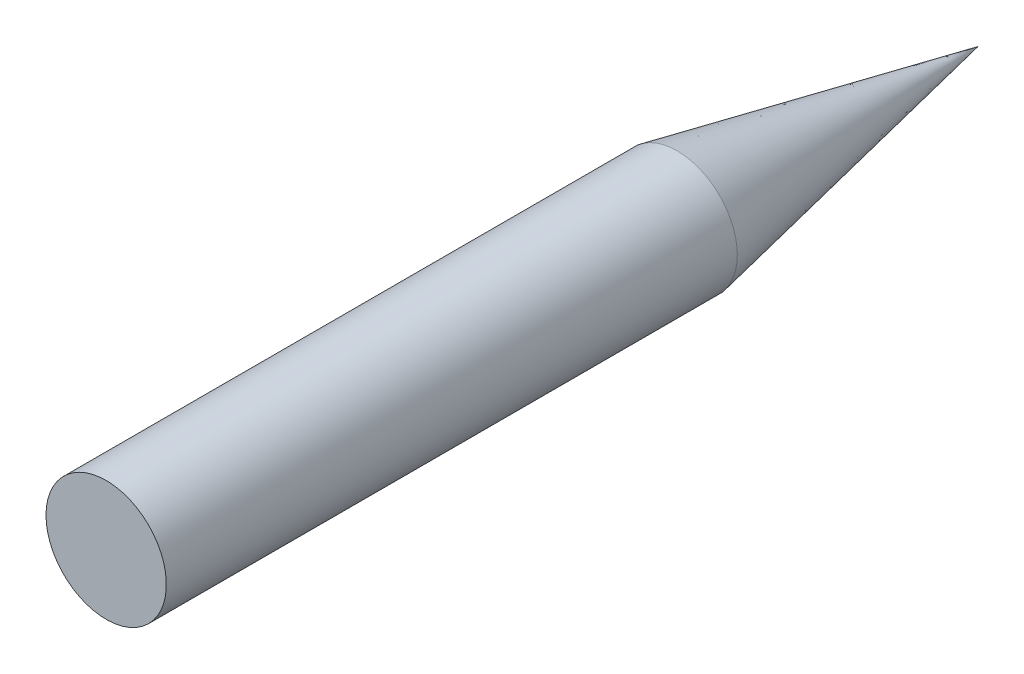
ISO-10303-21;
HEADER;
FILE_DESCRIPTION(('STEP AP214'),'2;1');
FILE_NAME('part.step','',(''),(''),'','','');
FILE_SCHEMA(('AUTOMOTIVE_DESIGN { 1 0 10303 214 1 1 1 1 }'));
ENDSEC;
DATA;
#1=APPLICATION_CONTEXT('core data for automotive mechanical design processes');
#2=APPLICATION_PROTOCOL_DEFINITION('international standard','automotive_design',2000,#1);
#3=PRODUCT_CONTEXT('',#1,'mechanical');
#4=PRODUCT('Part','Part','',(#3));
#5=PRODUCT_RELATED_PRODUCT_CATEGORY('part','',(#4));
#6=PRODUCT_DEFINITION_FORMATION('','',#4);
#7=PRODUCT_DEFINITION_CONTEXT('part definition',#1,'design');
#8=PRODUCT_DEFINITION('design','',#6,#7);
#9=PRODUCT_DEFINITION_SHAPE('','',#8);
#10=(LENGTH_UNIT() NAMED_UNIT(*) SI_UNIT(.MILLI.,.METRE.));
#11=(NAMED_UNIT(*) PLANE_ANGLE_UNIT() SI_UNIT($,.RADIAN.));
#12=(NAMED_UNIT(*) SI_UNIT($,.STERADIAN.) SOLID_ANGLE_UNIT());
#13=UNCERTAINTY_MEASURE_WITH_UNIT(LENGTH_MEASURE(1.E-05),#10,'distance_accuracy_value','');
#14=(GEOMETRIC_REPRESENTATION_CONTEXT(3) GLOBAL_UNCERTAINTY_ASSIGNED_CONTEXT((#13)) GLOBAL_UNIT_ASSIGNED_CONTEXT((#10,
#11,#12)) REPRESENTATION_CONTEXT('',''));
#15=CARTESIAN_POINT('',(0.,0.,0.));
#16=DIRECTION('',(0.,0.,1.));
#17=DIRECTION('',(1.,0.,0.));
#18=AXIS2_PLACEMENT_3D('',#15,#16,#17);
#19=CARTESIAN_POINT('',(0.,0.,0.999999999999997));
#20=DIRECTION('',(0.,0.,-1.));
#21=DIRECTION('',(-1.,0.,0.));
#22=AXIS2_PLACEMENT_3D('',#19,#20,#21);
#23=CYLINDRICAL_SURFACE('',#22,3.175);
#24=CARTESIAN_POINT('',(0.,0.,0.999999999999999));
#25=DIRECTION('',(0.,0.,-1.));
#26=DIRECTION('',(-1.,0.,0.));
#27=AXIS2_PLACEMENT_3D('',#24,#25,#26);
#28=CIRCLE('',#27,3.175);
#29=CARTESIAN_POINT('',(-3.175,0.,0.999999999999999));
#30=VERTEX_POINT('',#29);
#31=EDGE_CURVE('E13',#30,#30,#28,.T.);
#32=ORIENTED_EDGE('',*,*,#31,.T.);
#33=EDGE_LOOP('',(#32));
#34=FACE_BOUND('',#33,.T.);
#35=CARTESIAN_POINT('',(0.,0.,-29.125));
#36=DIRECTION('',(0.,0.,-1.));
#37=DIRECTION('',(-1.,0.,0.));
#38=AXIS2_PLACEMENT_3D('',#35,#36,#37);
#39=CIRCLE('',#38,3.175);
#40=CARTESIAN_POINT('',(-3.175,0.,-29.125));
#41=VERTEX_POINT('',#40);
#42=EDGE_CURVE('E57',#41,#41,#39,.T.);
#43=ORIENTED_EDGE('',*,*,#42,.F.);
#44=EDGE_LOOP('',(#43));
#45=FACE_BOUND('',#44,.T.);
#46=ADVANCED_FACE('F51',(#34,#45),#23,.T.);
#47=CARTESIAN_POINT('',(3.175,0.,0.999999999999998));
#48=DIRECTION('',(0.,0.,1.));
#49=DIRECTION('',(1.,0.,0.));
#50=AXIS2_PLACEMENT_3D('',#47,#48,#49);
#51=PLANE('',#50);
#52=ORIENTED_EDGE('',*,*,#31,.F.);
#53=EDGE_LOOP('',(#52));
#54=FACE_BOUND('',#53,.T.);
#55=ADVANCED_FACE('F62',(#54),#51,.T.);
#56=CARTESIAN_POINT('',(0.,0.,-45.));
#57=DIRECTION('',(0.,0.,1.));
#58=DIRECTION('',(1.,0.,0.));
#59=AXIS2_PLACEMENT_3D('',#56,#57,#58);
#60=CONICAL_SURFACE('',#59,0.,0.197395559849881);
#61=ORIENTED_EDGE('',*,*,#42,.T.);
#62=EDGE_LOOP('',(#61));
#63=FACE_BOUND('',#62,.T.);
#64=CARTESIAN_POINT('',(0.,0.,-45.));
#65=VERTEX_POINT('',#64);
#66=VERTEX_LOOP('',#65);
#67=FACE_BOUND('',#66,.T.);
#68=ADVANCED_FACE('F60',(#63,#67),#60,.T.);
#69=CLOSED_SHELL('',(#46,#55,#68));
#70=MANIFOLD_SOLID_BREP('B2',#69);
#71=ADVANCED_BREP_SHAPE_REPRESENTATION('',(#18,#70),#14);
#72=SHAPE_DEFINITION_REPRESENTATION(#9,#71);
ENDSEC;
END-ISO-10303-21;
